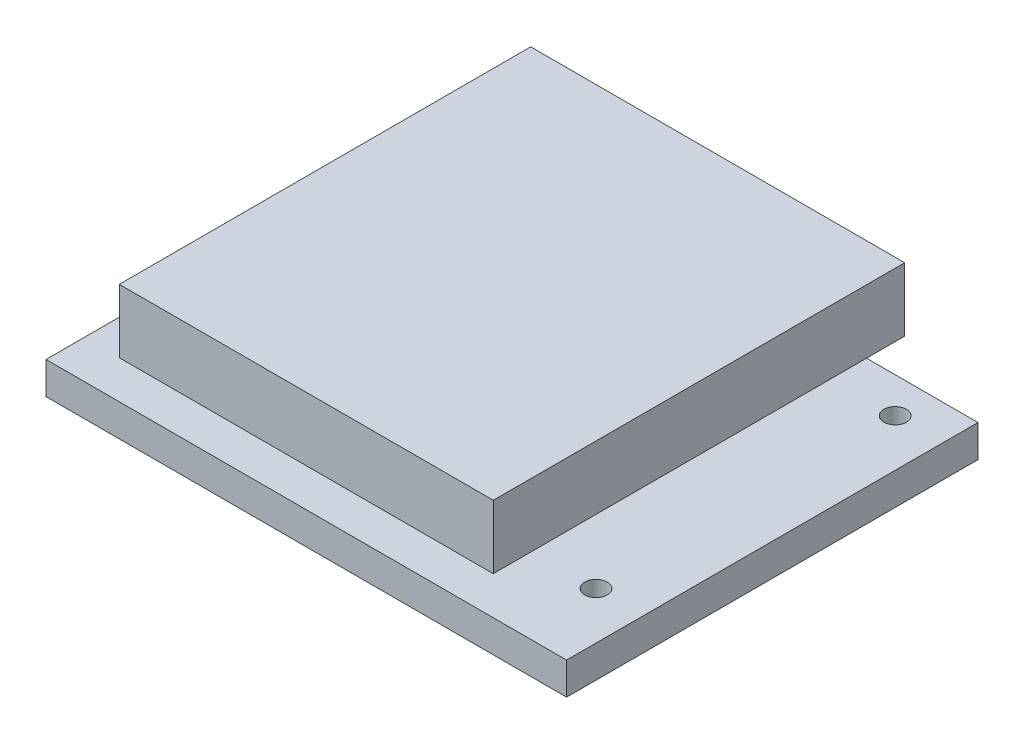
ISO-10303-21;
HEADER;
FILE_DESCRIPTION(('STEP AP214'),'2;1');
FILE_NAME('part.step','',(''),(''),'','','');
FILE_SCHEMA(('AUTOMOTIVE_DESIGN { 1 0 10303 214 1 1 1 1 }'));
ENDSEC;
DATA;
#1=APPLICATION_CONTEXT('core data for automotive mechanical design processes');
#2=APPLICATION_PROTOCOL_DEFINITION('international standard','automotive_design',2000,#1);
#3=PRODUCT_CONTEXT('',#1,'mechanical');
#4=PRODUCT('Part','Part','',(#3));
#5=PRODUCT_RELATED_PRODUCT_CATEGORY('part','',(#4));
#6=PRODUCT_DEFINITION_FORMATION('','',#4);
#7=PRODUCT_DEFINITION_CONTEXT('part definition',#1,'design');
#8=PRODUCT_DEFINITION('design','',#6,#7);
#9=PRODUCT_DEFINITION_SHAPE('','',#8);
#10=(LENGTH_UNIT() NAMED_UNIT(*) SI_UNIT(.MILLI.,.METRE.));
#11=(NAMED_UNIT(*) PLANE_ANGLE_UNIT() SI_UNIT($,.RADIAN.));
#12=(NAMED_UNIT(*) SI_UNIT($,.STERADIAN.) SOLID_ANGLE_UNIT());
#13=UNCERTAINTY_MEASURE_WITH_UNIT(LENGTH_MEASURE(1.E-05),#10,'distance_accuracy_value','');
#14=(GEOMETRIC_REPRESENTATION_CONTEXT(3) GLOBAL_UNCERTAINTY_ASSIGNED_CONTEXT((#13)) GLOBAL_UNIT_ASSIGNED_CONTEXT((#10,
#11,#12)) REPRESENTATION_CONTEXT('',''));
#15=CARTESIAN_POINT('',(0.,0.,0.));
#16=DIRECTION('',(0.,0.,1.));
#17=DIRECTION('',(1.,0.,0.));
#18=AXIS2_PLACEMENT_3D('',#15,#16,#17);
#19=CARTESIAN_POINT('',(-25.,10.9,27.5));
#20=DIRECTION('',(-1.,0.,0.));
#21=DIRECTION('',(0.,0.,1.));
#22=AXIS2_PLACEMENT_3D('',#19,#20,#21);
#23=PLANE('',#22);
#24=DIRECTION('',(0.,0.,-1.));
#25=VECTOR('',#24,1.);
#26=CARTESIAN_POINT('',(-25.,9.4,27.5));
#27=LINE('',#26,#25);
#28=CARTESIAN_POINT('',(-25.,9.4,27.5));
#29=VERTEX_POINT('',#28);
#30=CARTESIAN_POINT('',(-25.,9.4,-27.5));
#31=VERTEX_POINT('',#30);
#32=EDGE_CURVE('E122',#29,#31,#27,.T.);
#33=ORIENTED_EDGE('',*,*,#32,.F.);
#34=DIRECTION('',(0.,-1.,0.));
#35=VECTOR('',#34,1.);
#36=CARTESIAN_POINT('',(-25.,10.9,27.5));
#37=LINE('',#36,#35);
#38=CARTESIAN_POINT('',(-25.,17.9,27.5));
#39=VERTEX_POINT('',#38);
#40=EDGE_CURVE('E12',#39,#29,#37,.T.);
#41=ORIENTED_EDGE('',*,*,#40,.F.);
#42=DIRECTION('',(0.,0.,1.));
#43=VECTOR('',#42,1.);
#44=CARTESIAN_POINT('',(-25.,17.9,27.5));
#45=LINE('',#44,#43);
#46=CARTESIAN_POINT('',(-25.,17.9,-27.5));
#47=VERTEX_POINT('',#46);
#48=EDGE_CURVE('E110',#47,#39,#45,.T.);
#49=ORIENTED_EDGE('',*,*,#48,.F.);
#50=DIRECTION('',(0.,-1.,0.));
#51=VECTOR('',#50,1.);
#52=CARTESIAN_POINT('',(-25.,10.9,-27.5));
#53=LINE('',#52,#51);
#54=EDGE_CURVE('E56',#47,#31,#53,.T.);
#55=ORIENTED_EDGE('',*,*,#54,.T.);
#56=EDGE_LOOP('',(#33,#41,#49,#55));
#57=FACE_BOUND('',#56,.T.);
#58=ADVANCED_FACE('F53',(#57),#23,.T.);
#59=CARTESIAN_POINT('',(-25.,10.9,27.5));
#60=DIRECTION('',(0.,0.,-1.));
#61=DIRECTION('',(-1.,0.,0.));
#62=AXIS2_PLACEMENT_3D('',#59,#60,#61);
#63=PLANE('',#62);
#64=DIRECTION('',(1.,0.,0.));
#65=VECTOR('',#64,1.);
#66=CARTESIAN_POINT('',(-25.,9.4,27.5));
#67=LINE('',#66,#65);
#68=CARTESIAN_POINT('',(25.,9.4,27.5));
#69=VERTEX_POINT('',#68);
#70=EDGE_CURVE('E72',#29,#69,#67,.T.);
#71=ORIENTED_EDGE('',*,*,#70,.T.);
#72=DIRECTION('',(0.,-1.,0.));
#73=VECTOR('',#72,1.);
#74=CARTESIAN_POINT('',(25.,10.9,27.5));
#75=LINE('',#74,#73);
#76=CARTESIAN_POINT('',(25.,17.9,27.5));
#77=VERTEX_POINT('',#76);
#78=EDGE_CURVE('E62',#77,#69,#75,.T.);
#79=ORIENTED_EDGE('',*,*,#78,.F.);
#80=DIRECTION('',(1.,0.,0.));
#81=VECTOR('',#80,1.);
#82=CARTESIAN_POINT('',(-25.,17.9,27.5));
#83=LINE('',#82,#81);
#84=EDGE_CURVE('E114',#39,#77,#83,.T.);
#85=ORIENTED_EDGE('',*,*,#84,.F.);
#86=ORIENTED_EDGE('',*,*,#40,.T.);
#87=EDGE_LOOP('',(#71,#79,#85,#86));
#88=FACE_BOUND('',#87,.T.);
#89=ADVANCED_FACE('F139',(#88),#63,.F.);
#90=CARTESIAN_POINT('',(25.,10.9,27.5));
#91=DIRECTION('',(-1.,0.,0.));
#92=DIRECTION('',(0.,0.,1.));
#93=AXIS2_PLACEMENT_3D('',#90,#91,#92);
#94=PLANE('',#93);
#95=DIRECTION('',(0.,0.,-1.));
#96=VECTOR('',#95,1.);
#97=CARTESIAN_POINT('',(25.,9.4,27.5));
#98=LINE('',#97,#96);
#99=CARTESIAN_POINT('',(25.,9.4,-27.5));
#100=VERTEX_POINT('',#99);
#101=EDGE_CURVE('E98',#69,#100,#98,.T.);
#102=ORIENTED_EDGE('',*,*,#101,.T.);
#103=DIRECTION('',(0.,-1.,0.));
#104=VECTOR('',#103,1.);
#105=CARTESIAN_POINT('',(25.,10.9,-27.5));
#106=LINE('',#105,#104);
#107=CARTESIAN_POINT('',(25.,17.9,-27.5));
#108=VERTEX_POINT('',#107);
#109=EDGE_CURVE('E92',#108,#100,#106,.T.);
#110=ORIENTED_EDGE('',*,*,#109,.F.);
#111=DIRECTION('',(0.,0.,-1.));
#112=VECTOR('',#111,1.);
#113=CARTESIAN_POINT('',(25.,17.9,27.5));
#114=LINE('',#113,#112);
#115=EDGE_CURVE('E96',#77,#108,#114,.T.);
#116=ORIENTED_EDGE('',*,*,#115,.F.);
#117=ORIENTED_EDGE('',*,*,#78,.T.);
#118=EDGE_LOOP('',(#102,#110,#116,#117));
#119=FACE_BOUND('',#118,.T.);
#120=ADVANCED_FACE('F94',(#119),#94,.F.);
#121=CARTESIAN_POINT('',(-25.,10.9,-27.5));
#122=DIRECTION('',(0.,0.,-1.));
#123=DIRECTION('',(-1.,0.,0.));
#124=AXIS2_PLACEMENT_3D('',#121,#122,#123);
#125=PLANE('',#124);
#126=DIRECTION('',(1.,0.,0.));
#127=VECTOR('',#126,1.);
#128=CARTESIAN_POINT('',(-25.,9.4,-27.5));
#129=LINE('',#128,#127);
#130=EDGE_CURVE('E126',#31,#100,#129,.T.);
#131=ORIENTED_EDGE('',*,*,#130,.F.);
#132=ORIENTED_EDGE('',*,*,#54,.F.);
#133=DIRECTION('',(-1.,0.,0.));
#134=VECTOR('',#133,1.);
#135=CARTESIAN_POINT('',(-25.,17.9,-27.5));
#136=LINE('',#135,#134);
#137=EDGE_CURVE('E104',#108,#47,#136,.T.);
#138=ORIENTED_EDGE('',*,*,#137,.F.);
#139=ORIENTED_EDGE('',*,*,#109,.T.);
#140=EDGE_LOOP('',(#131,#132,#138,#139));
#141=FACE_BOUND('',#140,.T.);
#142=ADVANCED_FACE('F105',(#141),#125,.T.);
#143=CARTESIAN_POINT('',(0.,9.4,0.));
#144=DIRECTION('',(0.,-1.,0.));
#145=DIRECTION('',(0.,0.,-1.));
#146=AXIS2_PLACEMENT_3D('',#143,#144,#145);
#147=PLANE('',#146);
#148=ORIENTED_EDGE('',*,*,#32,.T.);
#149=ORIENTED_EDGE('',*,*,#130,.T.);
#150=ORIENTED_EDGE('',*,*,#101,.F.);
#151=ORIENTED_EDGE('',*,*,#70,.F.);
#152=EDGE_LOOP('',(#148,#149,#150,#151));
#153=FACE_BOUND('',#152,.T.);
#154=ADVANCED_FACE('F135',(#153),#147,.T.);
#155=CARTESIAN_POINT('',(0.,17.9,0.));
#156=DIRECTION('',(0.,-1.,0.));
#157=DIRECTION('',(0.,0.,-1.));
#158=AXIS2_PLACEMENT_3D('',#155,#156,#157);
#159=PLANE('',#158);
#160=ORIENTED_EDGE('',*,*,#115,.T.);
#161=ORIENTED_EDGE('',*,*,#137,.T.);
#162=ORIENTED_EDGE('',*,*,#48,.T.);
#163=ORIENTED_EDGE('',*,*,#84,.T.);
#164=EDGE_LOOP('',(#160,#161,#162,#163));
#165=FACE_BOUND('',#164,.T.);
#166=ADVANCED_FACE('F113',(#165),#159,.F.);
#167=CLOSED_SHELL('',(#58,#89,#120,#142,#154,#166));
#168=MANIFOLD_SOLID_BREP('B2',#167);
#169=CARTESIAN_POINT('',(0.,4.3,0.));
#170=DIRECTION('',(0.,-1.,0.));
#171=DIRECTION('',(0.,0.,-1.));
#172=AXIS2_PLACEMENT_3D('',#169,#170,#171);
#173=PLANE('',#172);
#174=DIRECTION('',(0.,0.,-1.));
#175=VECTOR('',#174,1.);
#176=CARTESIAN_POINT('',(34.8,4.3,27.5));
#177=LINE('',#176,#175);
#178=CARTESIAN_POINT('',(34.8,4.3,27.5));
#179=VERTEX_POINT('',#178);
#180=CARTESIAN_POINT('',(34.8,4.3,-27.5));
#181=VERTEX_POINT('',#180);
#182=EDGE_CURVE('E265',#179,#181,#177,.T.);
#183=ORIENTED_EDGE('',*,*,#182,.T.);
#184=DIRECTION('',(-1.,0.,0.));
#185=VECTOR('',#184,1.);
#186=CARTESIAN_POINT('',(-34.8,4.3,-27.5));
#187=LINE('',#186,#185);
#188=CARTESIAN_POINT('',(-34.8,4.3,-27.5));
#189=VERTEX_POINT('',#188);
#190=EDGE_CURVE('E260',#181,#189,#187,.T.);
#191=ORIENTED_EDGE('',*,*,#190,.T.);
#192=DIRECTION('',(0.,0.,1.));
#193=VECTOR('',#192,1.);
#194=CARTESIAN_POINT('',(-34.8,4.3,27.5));
#195=LINE('',#194,#193);
#196=CARTESIAN_POINT('',(-34.8,4.3,27.5));
#197=VERTEX_POINT('',#196);
#198=EDGE_CURVE('E263',#189,#197,#195,.T.);
#199=ORIENTED_EDGE('',*,*,#198,.T.);
#200=DIRECTION('',(1.,0.,0.));
#201=VECTOR('',#200,1.);
#202=CARTESIAN_POINT('',(-34.8,4.3,27.5));
#203=LINE('',#202,#201);
#204=EDGE_CURVE('E230',#197,#179,#203,.T.);
#205=ORIENTED_EDGE('',*,*,#204,.T.);
#206=EDGE_LOOP('',(#183,#191,#199,#205));
#207=FACE_BOUND('',#206,.T.);
#208=CARTESIAN_POINT('',(28.479128440367,4.3,-22.75));
#209=DIRECTION('',(0.,1.,0.));
#210=DIRECTION('',(0.,0.,1.));
#211=AXIS2_PLACEMENT_3D('',#208,#209,#210);
#212=CIRCLE('',#211,1.5);
#213=CARTESIAN_POINT('',(28.479128440367,4.3,-24.25));
#214=VERTEX_POINT('',#213);
#215=EDGE_CURVE('E280',#214,#214,#212,.T.);
#216=ORIENTED_EDGE('',*,*,#215,.F.);
#217=EDGE_LOOP('',(#216));
#218=FACE_BOUND('',#217,.T.);
#219=CARTESIAN_POINT('',(28.479128440367,4.3,17.25));
#220=DIRECTION('',(0.,1.,0.));
#221=DIRECTION('',(0.,0.,1.));
#222=AXIS2_PLACEMENT_3D('',#219,#220,#221);
#223=CIRCLE('',#222,1.5);
#224=CARTESIAN_POINT('',(28.479128440367,4.3,15.75));
#225=VERTEX_POINT('',#224);
#226=EDGE_CURVE('E295',#225,#225,#223,.T.);
#227=ORIENTED_EDGE('',*,*,#226,.F.);
#228=EDGE_LOOP('',(#227));
#229=FACE_BOUND('',#228,.T.);
#230=CARTESIAN_POINT('',(-28.479128440367,4.3,17.25));
#231=DIRECTION('',(0.,1.,0.));
#232=DIRECTION('',(0.,0.,-1.));
#233=AXIS2_PLACEMENT_3D('',#230,#231,#232);
#234=CIRCLE('',#233,1.5);
#235=CARTESIAN_POINT('',(-28.479128440367,4.3,15.75));
#236=VERTEX_POINT('',#235);
#237=EDGE_CURVE('E301',#236,#236,#234,.T.);
#238=ORIENTED_EDGE('',*,*,#237,.F.);
#239=EDGE_LOOP('',(#238));
#240=FACE_BOUND('',#239,.T.);
#241=CARTESIAN_POINT('',(-28.479128440367,4.3,-22.75));
#242=DIRECTION('',(0.,1.,0.));
#243=DIRECTION('',(0.,0.,-1.));
#244=AXIS2_PLACEMENT_3D('',#241,#242,#243);
#245=CIRCLE('',#244,1.5);
#246=CARTESIAN_POINT('',(-28.479128440367,4.3,-24.25));
#247=VERTEX_POINT('',#246);
#248=EDGE_CURVE('E307',#247,#247,#245,.T.);
#249=ORIENTED_EDGE('',*,*,#248,.F.);
#250=EDGE_LOOP('',(#249));
#251=FACE_BOUND('',#250,.T.);
#252=ADVANCED_FACE('F213',(#207,#218,#229,#240,#251),#173,.F.);
#253=CARTESIAN_POINT('',(0.,0.,0.));
#254=DIRECTION('',(0.,-1.,0.));
#255=DIRECTION('',(0.,0.,-1.));
#256=AXIS2_PLACEMENT_3D('',#253,#254,#255);
#257=PLANE('',#256);
#258=CARTESIAN_POINT('',(-28.479128440367,0.,17.25));
#259=DIRECTION('',(0.,1.,0.));
#260=DIRECTION('',(0.,0.,-1.));
#261=AXIS2_PLACEMENT_3D('',#258,#259,#260);
#262=CIRCLE('',#261,1.5);
#263=CARTESIAN_POINT('',(-28.479128440367,0.,15.75));
#264=VERTEX_POINT('',#263);
#265=EDGE_CURVE('E304',#264,#264,#262,.T.);
#266=ORIENTED_EDGE('',*,*,#265,.T.);
#267=EDGE_LOOP('',(#266));
#268=FACE_BOUND('',#267,.T.);
#269=CARTESIAN_POINT('',(28.479128440367,0.,-22.75));
#270=DIRECTION('',(0.,1.,0.));
#271=DIRECTION('',(0.,0.,1.));
#272=AXIS2_PLACEMENT_3D('',#269,#270,#271);
#273=CIRCLE('',#272,1.5);
#274=CARTESIAN_POINT('',(28.479128440367,0.,-24.25));
#275=VERTEX_POINT('',#274);
#276=EDGE_CURVE('E292',#275,#275,#273,.T.);
#277=ORIENTED_EDGE('',*,*,#276,.T.);
#278=EDGE_LOOP('',(#277));
#279=FACE_BOUND('',#278,.T.);
#280=DIRECTION('',(0.,0.,-1.));
#281=VECTOR('',#280,1.);
#282=CARTESIAN_POINT('',(34.8,0.,27.5));
#283=LINE('',#282,#281);
#284=CARTESIAN_POINT('',(34.8,0.,27.5));
#285=VERTEX_POINT('',#284);
#286=CARTESIAN_POINT('',(34.8,0.,-27.5));
#287=VERTEX_POINT('',#286);
#288=EDGE_CURVE('E277',#285,#287,#283,.T.);
#289=ORIENTED_EDGE('',*,*,#288,.F.);
#290=DIRECTION('',(1.,0.,0.));
#291=VECTOR('',#290,1.);
#292=CARTESIAN_POINT('',(-34.8,0.,27.5));
#293=LINE('',#292,#291);
#294=CARTESIAN_POINT('',(-34.8,0.,27.5));
#295=VERTEX_POINT('',#294);
#296=EDGE_CURVE('E253',#295,#285,#293,.T.);
#297=ORIENTED_EDGE('',*,*,#296,.F.);
#298=DIRECTION('',(0.,0.,1.));
#299=VECTOR('',#298,1.);
#300=CARTESIAN_POINT('',(-34.8,0.,27.5));
#301=LINE('',#300,#299);
#302=CARTESIAN_POINT('',(-34.8,0.,-27.5));
#303=VERTEX_POINT('',#302);
#304=EDGE_CURVE('E247',#303,#295,#301,.T.);
#305=ORIENTED_EDGE('',*,*,#304,.F.);
#306=DIRECTION('',(-1.,0.,0.));
#307=VECTOR('',#306,1.);
#308=CARTESIAN_POINT('',(-34.8,0.,-27.5));
#309=LINE('',#308,#307);
#310=EDGE_CURVE('E269',#287,#303,#309,.T.);
#311=ORIENTED_EDGE('',*,*,#310,.F.);
#312=EDGE_LOOP('',(#289,#297,#305,#311));
#313=FACE_BOUND('',#312,.T.);
#314=CARTESIAN_POINT('',(28.479128440367,0.,17.25));
#315=DIRECTION('',(0.,1.,0.));
#316=DIRECTION('',(0.,0.,1.));
#317=AXIS2_PLACEMENT_3D('',#314,#315,#316);
#318=CIRCLE('',#317,1.5);
#319=CARTESIAN_POINT('',(28.479128440367,0.,15.75));
#320=VERTEX_POINT('',#319);
#321=EDGE_CURVE('E298',#320,#320,#318,.T.);
#322=ORIENTED_EDGE('',*,*,#321,.T.);
#323=EDGE_LOOP('',(#322));
#324=FACE_BOUND('',#323,.T.);
#325=CARTESIAN_POINT('',(-28.479128440367,0.,-22.75));
#326=DIRECTION('',(0.,1.,0.));
#327=DIRECTION('',(0.,0.,-1.));
#328=AXIS2_PLACEMENT_3D('',#325,#326,#327);
#329=CIRCLE('',#328,1.5);
#330=CARTESIAN_POINT('',(-28.479128440367,0.,-24.25));
#331=VERTEX_POINT('',#330);
#332=EDGE_CURVE('E310',#331,#331,#329,.T.);
#333=ORIENTED_EDGE('',*,*,#332,.T.);
#334=EDGE_LOOP('',(#333));
#335=FACE_BOUND('',#334,.T.);
#336=ADVANCED_FACE('F288',(#268,#279,#313,#324,#335),#257,.T.);
#337=CARTESIAN_POINT('',(34.8,4.3,27.5));
#338=DIRECTION('',(-1.,0.,0.));
#339=DIRECTION('',(0.,0.,1.));
#340=AXIS2_PLACEMENT_3D('',#337,#338,#339);
#341=PLANE('',#340);
#342=ORIENTED_EDGE('',*,*,#288,.T.);
#343=DIRECTION('',(0.,-1.,0.));
#344=VECTOR('',#343,1.);
#345=CARTESIAN_POINT('',(34.8,4.3,-27.5));
#346=LINE('',#345,#344);
#347=EDGE_CURVE('E51',#181,#287,#346,.T.);
#348=ORIENTED_EDGE('',*,*,#347,.F.);
#349=ORIENTED_EDGE('',*,*,#182,.F.);
#350=DIRECTION('',(0.,-1.,0.));
#351=VECTOR('',#350,1.);
#352=CARTESIAN_POINT('',(34.8,4.3,27.5));
#353=LINE('',#352,#351);
#354=EDGE_CURVE('E273',#179,#285,#353,.T.);
#355=ORIENTED_EDGE('',*,*,#354,.T.);
#356=EDGE_LOOP('',(#342,#348,#349,#355));
#357=FACE_BOUND('',#356,.T.);
#358=ADVANCED_FACE('F215',(#357),#341,.F.);
#359=CARTESIAN_POINT('',(-34.8,4.3,-27.5));
#360=DIRECTION('',(0.,0.,1.));
#361=DIRECTION('',(1.,0.,0.));
#362=AXIS2_PLACEMENT_3D('',#359,#360,#361);
#363=PLANE('',#362);
#364=ORIENTED_EDGE('',*,*,#310,.T.);
#365=DIRECTION('',(0.,-1.,0.));
#366=VECTOR('',#365,1.);
#367=CARTESIAN_POINT('',(-34.8,4.3,-27.5));
#368=LINE('',#367,#366);
#369=EDGE_CURVE('E222',#189,#303,#368,.T.);
#370=ORIENTED_EDGE('',*,*,#369,.F.);
#371=ORIENTED_EDGE('',*,*,#190,.F.);
#372=ORIENTED_EDGE('',*,*,#347,.T.);
#373=EDGE_LOOP('',(#364,#370,#371,#372));
#374=FACE_BOUND('',#373,.T.);
#375=ADVANCED_FACE('F268',(#374),#363,.F.);
#376=CARTESIAN_POINT('',(-34.8,4.3,27.5));
#377=DIRECTION('',(1.,0.,0.));
#378=DIRECTION('',(0.,0.,-1.));
#379=AXIS2_PLACEMENT_3D('',#376,#377,#378);
#380=PLANE('',#379);
#381=ORIENTED_EDGE('',*,*,#304,.T.);
#382=DIRECTION('',(0.,-1.,0.));
#383=VECTOR('',#382,1.);
#384=CARTESIAN_POINT('',(-34.8,4.3,27.5));
#385=LINE('',#384,#383);
#386=EDGE_CURVE('E270',#197,#295,#385,.T.);
#387=ORIENTED_EDGE('',*,*,#386,.F.);
#388=ORIENTED_EDGE('',*,*,#198,.F.);
#389=ORIENTED_EDGE('',*,*,#369,.T.);
#390=EDGE_LOOP('',(#381,#387,#388,#389));
#391=FACE_BOUND('',#390,.T.);
#392=ADVANCED_FACE('F271',(#391),#380,.F.);
#393=CARTESIAN_POINT('',(-34.8,4.3,27.5));
#394=DIRECTION('',(0.,0.,-1.));
#395=DIRECTION('',(-1.,0.,0.));
#396=AXIS2_PLACEMENT_3D('',#393,#394,#395);
#397=PLANE('',#396);
#398=ORIENTED_EDGE('',*,*,#296,.T.);
#399=ORIENTED_EDGE('',*,*,#354,.F.);
#400=ORIENTED_EDGE('',*,*,#204,.F.);
#401=ORIENTED_EDGE('',*,*,#386,.T.);
#402=EDGE_LOOP('',(#398,#399,#400,#401));
#403=FACE_BOUND('',#402,.T.);
#404=ADVANCED_FACE('F285',(#403),#397,.F.);
#405=CARTESIAN_POINT('',(28.479128440367,4.3,-22.75));
#406=DIRECTION('',(0.,-1.,0.));
#407=DIRECTION('',(0.,0.,-1.));
#408=AXIS2_PLACEMENT_3D('',#405,#406,#407);
#409=CYLINDRICAL_SURFACE('',#408,1.5);
#410=CARTESIAN_POINT('',(28.479128440367,4.3,-24.25));
#411=CARTESIAN_POINT('',(28.479128440367,4.25520833333333,-24.25));
#412=CARTESIAN_POINT('',(28.479128440367,4.21041666666667,-24.25));
#413=CARTESIAN_POINT('',(28.479128440367,4.12083333333333,-24.25));
#414=CARTESIAN_POINT('',(28.479128440367,4.07604166666667,-24.25));
#415=CARTESIAN_POINT('',(28.479128440367,3.98645833333333,-24.25));
#416=CARTESIAN_POINT('',(28.479128440367,3.94166666666667,-24.25));
#417=CARTESIAN_POINT('',(28.479128440367,3.85208333333333,-24.25));
#418=CARTESIAN_POINT('',(28.479128440367,3.80729166666667,-24.25));
#419=CARTESIAN_POINT('',(28.479128440367,3.71770833333333,-24.25));
#420=CARTESIAN_POINT('',(28.479128440367,3.67291666666667,-24.25));
#421=CARTESIAN_POINT('',(28.479128440367,3.58333333333333,-24.25));
#422=CARTESIAN_POINT('',(28.479128440367,3.53854166666667,-24.25));
#423=CARTESIAN_POINT('',(28.479128440367,3.44895833333333,-24.25));
#424=CARTESIAN_POINT('',(28.479128440367,3.40416666666667,-24.25));
#425=CARTESIAN_POINT('',(28.479128440367,3.31458333333333,-24.25));
#426=CARTESIAN_POINT('',(28.479128440367,3.26979166666667,-24.25));
#427=CARTESIAN_POINT('',(28.479128440367,3.18020833333333,-24.25));
#428=CARTESIAN_POINT('',(28.479128440367,3.13541666666667,-24.25));
#429=CARTESIAN_POINT('',(28.479128440367,3.04583333333333,-24.25));
#430=CARTESIAN_POINT('',(28.479128440367,3.00104166666667,-24.25));
#431=CARTESIAN_POINT('',(28.479128440367,2.91145833333333,-24.25));
#432=CARTESIAN_POINT('',(28.479128440367,2.86666666666667,-24.25));
#433=CARTESIAN_POINT('',(28.479128440367,2.77708333333333,-24.25));
#434=CARTESIAN_POINT('',(28.479128440367,2.73229166666667,-24.25));
#435=CARTESIAN_POINT('',(28.479128440367,2.64270833333333,-24.25));
#436=CARTESIAN_POINT('',(28.479128440367,2.59791666666667,-24.25));
#437=CARTESIAN_POINT('',(28.479128440367,2.50833333333333,-24.25));
#438=CARTESIAN_POINT('',(28.479128440367,2.46354166666667,-24.25));
#439=CARTESIAN_POINT('',(28.479128440367,2.37395833333333,-24.25));
#440=CARTESIAN_POINT('',(28.479128440367,2.32916666666667,-24.25));
#441=CARTESIAN_POINT('',(28.479128440367,2.23958333333333,-24.25));
#442=CARTESIAN_POINT('',(28.479128440367,2.19479166666667,-24.25));
#443=CARTESIAN_POINT('',(28.479128440367,2.10520833333333,-24.25));
#444=CARTESIAN_POINT('',(28.479128440367,2.06041666666667,-24.25));
#445=CARTESIAN_POINT('',(28.479128440367,1.97083333333333,-24.25));
#446=CARTESIAN_POINT('',(28.479128440367,1.92604166666667,-24.25));
#447=CARTESIAN_POINT('',(28.479128440367,1.83645833333333,-24.25));
#448=CARTESIAN_POINT('',(28.479128440367,1.79166666666667,-24.25));
#449=CARTESIAN_POINT('',(28.479128440367,1.70208333333333,-24.25));
#450=CARTESIAN_POINT('',(28.479128440367,1.65729166666667,-24.25));
#451=CARTESIAN_POINT('',(28.479128440367,1.56770833333333,-24.25));
#452=CARTESIAN_POINT('',(28.479128440367,1.52291666666667,-24.25));
#453=CARTESIAN_POINT('',(28.479128440367,1.43333333333333,-24.25));
#454=CARTESIAN_POINT('',(28.479128440367,1.38854166666667,-24.25));
#455=CARTESIAN_POINT('',(28.479128440367,1.29895833333333,-24.25));
#456=CARTESIAN_POINT('',(28.479128440367,1.25416666666667,-24.25));
#457=CARTESIAN_POINT('',(28.479128440367,1.16458333333333,-24.25));
#458=CARTESIAN_POINT('',(28.479128440367,1.11979166666667,-24.25));
#459=CARTESIAN_POINT('',(28.479128440367,1.03020833333333,-24.25));
#460=CARTESIAN_POINT('',(28.479128440367,0.985416666666666,-24.25));
#461=CARTESIAN_POINT('',(28.479128440367,0.895833333333333,-24.25));
#462=CARTESIAN_POINT('',(28.479128440367,0.851041666666666,-24.25));
#463=CARTESIAN_POINT('',(28.479128440367,0.761458333333333,-24.25));
#464=CARTESIAN_POINT('',(28.479128440367,0.716666666666666,-24.25));
#465=CARTESIAN_POINT('',(28.479128440367,0.627083333333333,-24.25));
#466=CARTESIAN_POINT('',(28.479128440367,0.582291666666666,-24.25));
#467=CARTESIAN_POINT('',(28.479128440367,0.492708333333333,-24.25));
#468=CARTESIAN_POINT('',(28.479128440367,0.447916666666666,-24.25));
#469=CARTESIAN_POINT('',(28.479128440367,0.358333333333333,-24.25));
#470=CARTESIAN_POINT('',(28.479128440367,0.313541666666666,-24.25));
#471=CARTESIAN_POINT('',(28.479128440367,0.223958333333332,-24.25));
#472=CARTESIAN_POINT('',(28.479128440367,0.179166666666666,-24.25));
#473=CARTESIAN_POINT('',(28.479128440367,0.0895833333333324,-24.25));
#474=CARTESIAN_POINT('',(28.479128440367,0.0447916666666658,-24.25));
#475=CARTESIAN_POINT('',(28.479128440367,0.,-24.25));
#476=B_SPLINE_CURVE_WITH_KNOTS('',3,(#410,#411,#412,#413,#414,#415,#416,#417,#418,#419,#420,
#421,#422,#423,#424,#425,#426,#427,#428,#429,#430,#431,#432,#433,#434,#435,#436,#437,#438,#439,
#440,#441,#442,#443,#444,#445,#446,#447,#448,#449,#450,#451,#452,#453,#454,#455,#456,#457,#458,
#459,#460,#461,#462,#463,#464,#465,#466,#467,#468,#469,#470,#471,#472,#473,#474,#475),
.UNSPECIFIED.,.F.,.F.,(4,2,2,2,2,2,2,2,2,2,2,2,2,2,2,2,2,2,2,2,2,2,2,2,2,2,2,2,2,2,2,2,4),(0.,
0.134375,0.26875,0.403124999999999,0.5375,0.671875,0.80625,0.940625,1.075,1.209375,1.34375,
1.478125,1.6125,1.746875,1.88125,2.015625,2.15,2.284375,2.41875,2.553125,2.6875,2.821875,
2.95625,3.090625,3.225,3.359375,3.49375,3.628125,3.7625,3.896875,4.03125,4.165625,4.3),.UNSPECIFIED.);
#477=EDGE_CURVE('BSEAM327',#214,#275,#476,.T.);
#478=ORIENTED_EDGE('',*,*,#215,.T.);
#479=ORIENTED_EDGE('',*,*,#276,.F.);
#480=ORIENTED_EDGE('',*,*,#477,.T.);
#481=ORIENTED_EDGE('',*,*,#477,.F.);
#482=EDGE_LOOP('',(#478,#480,#479,#481));
#483=FACE_BOUND('',#482,.T.);
#484=ADVANCED_FACE('F327',(#483),#409,.F.);
#485=CARTESIAN_POINT('',(28.479128440367,4.3,17.25));
#486=DIRECTION('',(0.,-1.,0.));
#487=DIRECTION('',(0.,0.,-1.));
#488=AXIS2_PLACEMENT_3D('',#485,#486,#487);
#489=CYLINDRICAL_SURFACE('',#488,1.5);
#490=CARTESIAN_POINT('',(28.479128440367,4.3,15.75));
#491=CARTESIAN_POINT('',(28.479128440367,4.25520833333333,15.75));
#492=CARTESIAN_POINT('',(28.479128440367,4.21041666666667,15.75));
#493=CARTESIAN_POINT('',(28.479128440367,4.12083333333333,15.75));
#494=CARTESIAN_POINT('',(28.479128440367,4.07604166666667,15.75));
#495=CARTESIAN_POINT('',(28.479128440367,3.98645833333333,15.75));
#496=CARTESIAN_POINT('',(28.479128440367,3.94166666666667,15.75));
#497=CARTESIAN_POINT('',(28.479128440367,3.85208333333333,15.75));
#498=CARTESIAN_POINT('',(28.479128440367,3.80729166666667,15.75));
#499=CARTESIAN_POINT('',(28.479128440367,3.71770833333333,15.75));
#500=CARTESIAN_POINT('',(28.479128440367,3.67291666666667,15.75));
#501=CARTESIAN_POINT('',(28.479128440367,3.58333333333333,15.75));
#502=CARTESIAN_POINT('',(28.479128440367,3.53854166666667,15.75));
#503=CARTESIAN_POINT('',(28.479128440367,3.44895833333333,15.75));
#504=CARTESIAN_POINT('',(28.479128440367,3.40416666666667,15.75));
#505=CARTESIAN_POINT('',(28.479128440367,3.31458333333333,15.75));
#506=CARTESIAN_POINT('',(28.479128440367,3.26979166666667,15.75));
#507=CARTESIAN_POINT('',(28.479128440367,3.18020833333333,15.75));
#508=CARTESIAN_POINT('',(28.479128440367,3.13541666666667,15.75));
#509=CARTESIAN_POINT('',(28.479128440367,3.04583333333333,15.75));
#510=CARTESIAN_POINT('',(28.479128440367,3.00104166666667,15.75));
#511=CARTESIAN_POINT('',(28.479128440367,2.91145833333333,15.75));
#512=CARTESIAN_POINT('',(28.479128440367,2.86666666666667,15.75));
#513=CARTESIAN_POINT('',(28.479128440367,2.77708333333333,15.75));
#514=CARTESIAN_POINT('',(28.479128440367,2.73229166666667,15.75));
#515=CARTESIAN_POINT('',(28.479128440367,2.64270833333333,15.75));
#516=CARTESIAN_POINT('',(28.479128440367,2.59791666666667,15.75));
#517=CARTESIAN_POINT('',(28.479128440367,2.50833333333333,15.75));
#518=CARTESIAN_POINT('',(28.479128440367,2.46354166666667,15.75));
#519=CARTESIAN_POINT('',(28.479128440367,2.37395833333333,15.75));
#520=CARTESIAN_POINT('',(28.479128440367,2.32916666666667,15.75));
#521=CARTESIAN_POINT('',(28.479128440367,2.23958333333333,15.75));
#522=CARTESIAN_POINT('',(28.479128440367,2.19479166666667,15.75));
#523=CARTESIAN_POINT('',(28.479128440367,2.10520833333333,15.75));
#524=CARTESIAN_POINT('',(28.479128440367,2.06041666666667,15.75));
#525=CARTESIAN_POINT('',(28.479128440367,1.97083333333333,15.75));
#526=CARTESIAN_POINT('',(28.479128440367,1.92604166666667,15.75));
#527=CARTESIAN_POINT('',(28.479128440367,1.83645833333333,15.75));
#528=CARTESIAN_POINT('',(28.479128440367,1.79166666666667,15.75));
#529=CARTESIAN_POINT('',(28.479128440367,1.70208333333333,15.75));
#530=CARTESIAN_POINT('',(28.479128440367,1.65729166666667,15.75));
#531=CARTESIAN_POINT('',(28.479128440367,1.56770833333333,15.75));
#532=CARTESIAN_POINT('',(28.479128440367,1.52291666666667,15.75));
#533=CARTESIAN_POINT('',(28.479128440367,1.43333333333333,15.75));
#534=CARTESIAN_POINT('',(28.479128440367,1.38854166666667,15.75));
#535=CARTESIAN_POINT('',(28.479128440367,1.29895833333333,15.75));
#536=CARTESIAN_POINT('',(28.479128440367,1.25416666666667,15.75));
#537=CARTESIAN_POINT('',(28.479128440367,1.16458333333333,15.75));
#538=CARTESIAN_POINT('',(28.479128440367,1.11979166666667,15.75));
#539=CARTESIAN_POINT('',(28.479128440367,1.03020833333333,15.75));
#540=CARTESIAN_POINT('',(28.479128440367,0.985416666666666,15.75));
#541=CARTESIAN_POINT('',(28.479128440367,0.895833333333333,15.75));
#542=CARTESIAN_POINT('',(28.479128440367,0.851041666666666,15.75));
#543=CARTESIAN_POINT('',(28.479128440367,0.761458333333333,15.75));
#544=CARTESIAN_POINT('',(28.479128440367,0.716666666666666,15.75));
#545=CARTESIAN_POINT('',(28.479128440367,0.627083333333333,15.75));
#546=CARTESIAN_POINT('',(28.479128440367,0.582291666666666,15.75));
#547=CARTESIAN_POINT('',(28.479128440367,0.492708333333333,15.75));
#548=CARTESIAN_POINT('',(28.479128440367,0.447916666666666,15.75));
#549=CARTESIAN_POINT('',(28.479128440367,0.358333333333333,15.75));
#550=CARTESIAN_POINT('',(28.479128440367,0.313541666666666,15.75));
#551=CARTESIAN_POINT('',(28.479128440367,0.223958333333332,15.75));
#552=CARTESIAN_POINT('',(28.479128440367,0.179166666666666,15.75));
#553=CARTESIAN_POINT('',(28.479128440367,0.0895833333333324,15.75));
#554=CARTESIAN_POINT('',(28.479128440367,0.0447916666666658,15.75));
#555=CARTESIAN_POINT('',(28.479128440367,0.,15.75));
#556=B_SPLINE_CURVE_WITH_KNOTS('',3,(#490,#491,#492,#493,#494,#495,#496,#497,#498,#499,#500,
#501,#502,#503,#504,#505,#506,#507,#508,#509,#510,#511,#512,#513,#514,#515,#516,#517,#518,#519,
#520,#521,#522,#523,#524,#525,#526,#527,#528,#529,#530,#531,#532,#533,#534,#535,#536,#537,#538,
#539,#540,#541,#542,#543,#544,#545,#546,#547,#548,#549,#550,#551,#552,#553,#554,#555),
.UNSPECIFIED.,.F.,.F.,(4,2,2,2,2,2,2,2,2,2,2,2,2,2,2,2,2,2,2,2,2,2,2,2,2,2,2,2,2,2,2,2,4),(0.,
0.134375,0.26875,0.403124999999999,0.5375,0.671875,0.80625,0.940625,1.075,1.209375,1.34375,
1.478125,1.6125,1.746875,1.88125,2.015625,2.15,2.284375,2.41875,2.553125,2.6875,2.821875,
2.95625,3.090625,3.225,3.359375,3.49375,3.628125,3.7625,3.896875,4.03125,4.165625,4.3),.UNSPECIFIED.);
#557=EDGE_CURVE('BSEAM381',#225,#320,#556,.T.);
#558=ORIENTED_EDGE('',*,*,#226,.T.);
#559=ORIENTED_EDGE('',*,*,#321,.F.);
#560=ORIENTED_EDGE('',*,*,#557,.T.);
#561=ORIENTED_EDGE('',*,*,#557,.F.);
#562=EDGE_LOOP('',(#558,#560,#559,#561));
#563=FACE_BOUND('',#562,.T.);
#564=ADVANCED_FACE('F381',(#563),#489,.F.);
#565=CARTESIAN_POINT('',(-28.479128440367,4.3,17.25));
#566=DIRECTION('',(0.,-1.,0.));
#567=DIRECTION('',(0.,0.,-1.));
#568=AXIS2_PLACEMENT_3D('',#565,#566,#567);
#569=CYLINDRICAL_SURFACE('',#568,1.5);
#570=CARTESIAN_POINT('',(-28.479128440367,4.3,15.75));
#571=CARTESIAN_POINT('',(-28.479128440367,4.25520833333333,15.75));
#572=CARTESIAN_POINT('',(-28.479128440367,4.21041666666667,15.75));
#573=CARTESIAN_POINT('',(-28.479128440367,4.12083333333333,15.75));
#574=CARTESIAN_POINT('',(-28.479128440367,4.07604166666667,15.75));
#575=CARTESIAN_POINT('',(-28.479128440367,3.98645833333333,15.75));
#576=CARTESIAN_POINT('',(-28.479128440367,3.94166666666667,15.75));
#577=CARTESIAN_POINT('',(-28.479128440367,3.85208333333333,15.75));
#578=CARTESIAN_POINT('',(-28.479128440367,3.80729166666667,15.75));
#579=CARTESIAN_POINT('',(-28.479128440367,3.71770833333333,15.75));
#580=CARTESIAN_POINT('',(-28.479128440367,3.67291666666667,15.75));
#581=CARTESIAN_POINT('',(-28.479128440367,3.58333333333333,15.75));
#582=CARTESIAN_POINT('',(-28.479128440367,3.53854166666667,15.75));
#583=CARTESIAN_POINT('',(-28.479128440367,3.44895833333333,15.75));
#584=CARTESIAN_POINT('',(-28.479128440367,3.40416666666667,15.75));
#585=CARTESIAN_POINT('',(-28.479128440367,3.31458333333333,15.75));
#586=CARTESIAN_POINT('',(-28.479128440367,3.26979166666667,15.75));
#587=CARTESIAN_POINT('',(-28.479128440367,3.18020833333333,15.75));
#588=CARTESIAN_POINT('',(-28.479128440367,3.13541666666667,15.75));
#589=CARTESIAN_POINT('',(-28.479128440367,3.04583333333333,15.75));
#590=CARTESIAN_POINT('',(-28.479128440367,3.00104166666667,15.75));
#591=CARTESIAN_POINT('',(-28.479128440367,2.91145833333333,15.75));
#592=CARTESIAN_POINT('',(-28.479128440367,2.86666666666667,15.75));
#593=CARTESIAN_POINT('',(-28.479128440367,2.77708333333333,15.75));
#594=CARTESIAN_POINT('',(-28.479128440367,2.73229166666667,15.75));
#595=CARTESIAN_POINT('',(-28.479128440367,2.64270833333333,15.75));
#596=CARTESIAN_POINT('',(-28.479128440367,2.59791666666667,15.75));
#597=CARTESIAN_POINT('',(-28.479128440367,2.50833333333333,15.75));
#598=CARTESIAN_POINT('',(-28.479128440367,2.46354166666667,15.75));
#599=CARTESIAN_POINT('',(-28.479128440367,2.37395833333333,15.75));
#600=CARTESIAN_POINT('',(-28.479128440367,2.32916666666667,15.75));
#601=CARTESIAN_POINT('',(-28.479128440367,2.23958333333333,15.75));
#602=CARTESIAN_POINT('',(-28.479128440367,2.19479166666667,15.75));
#603=CARTESIAN_POINT('',(-28.479128440367,2.10520833333333,15.75));
#604=CARTESIAN_POINT('',(-28.479128440367,2.06041666666667,15.75));
#605=CARTESIAN_POINT('',(-28.479128440367,1.97083333333333,15.75));
#606=CARTESIAN_POINT('',(-28.479128440367,1.92604166666667,15.75));
#607=CARTESIAN_POINT('',(-28.479128440367,1.83645833333333,15.75));
#608=CARTESIAN_POINT('',(-28.479128440367,1.79166666666667,15.75));
#609=CARTESIAN_POINT('',(-28.479128440367,1.70208333333333,15.75));
#610=CARTESIAN_POINT('',(-28.479128440367,1.65729166666667,15.75));
#611=CARTESIAN_POINT('',(-28.479128440367,1.56770833333333,15.75));
#612=CARTESIAN_POINT('',(-28.479128440367,1.52291666666667,15.75));
#613=CARTESIAN_POINT('',(-28.479128440367,1.43333333333333,15.75));
#614=CARTESIAN_POINT('',(-28.479128440367,1.38854166666667,15.75));
#615=CARTESIAN_POINT('',(-28.479128440367,1.29895833333333,15.75));
#616=CARTESIAN_POINT('',(-28.479128440367,1.25416666666667,15.75));
#617=CARTESIAN_POINT('',(-28.479128440367,1.16458333333333,15.75));
#618=CARTESIAN_POINT('',(-28.479128440367,1.11979166666667,15.75));
#619=CARTESIAN_POINT('',(-28.479128440367,1.03020833333333,15.75));
#620=CARTESIAN_POINT('',(-28.479128440367,0.985416666666666,15.75));
#621=CARTESIAN_POINT('',(-28.479128440367,0.895833333333333,15.75));
#622=CARTESIAN_POINT('',(-28.479128440367,0.851041666666666,15.75));
#623=CARTESIAN_POINT('',(-28.479128440367,0.761458333333333,15.75));
#624=CARTESIAN_POINT('',(-28.479128440367,0.716666666666666,15.75));
#625=CARTESIAN_POINT('',(-28.479128440367,0.627083333333333,15.75));
#626=CARTESIAN_POINT('',(-28.479128440367,0.582291666666666,15.75));
#627=CARTESIAN_POINT('',(-28.479128440367,0.492708333333333,15.75));
#628=CARTESIAN_POINT('',(-28.479128440367,0.447916666666666,15.75));
#629=CARTESIAN_POINT('',(-28.479128440367,0.358333333333333,15.75));
#630=CARTESIAN_POINT('',(-28.479128440367,0.313541666666666,15.75));
#631=CARTESIAN_POINT('',(-28.479128440367,0.223958333333332,15.75));
#632=CARTESIAN_POINT('',(-28.479128440367,0.179166666666666,15.75));
#633=CARTESIAN_POINT('',(-28.479128440367,0.0895833333333324,15.75));
#634=CARTESIAN_POINT('',(-28.479128440367,0.0447916666666658,15.75));
#635=CARTESIAN_POINT('',(-28.479128440367,0.,15.75));
#636=B_SPLINE_CURVE_WITH_KNOTS('',3,(#570,#571,#572,#573,#574,#575,#576,#577,#578,#579,#580,
#581,#582,#583,#584,#585,#586,#587,#588,#589,#590,#591,#592,#593,#594,#595,#596,#597,#598,#599,
#600,#601,#602,#603,#604,#605,#606,#607,#608,#609,#610,#611,#612,#613,#614,#615,#616,#617,#618,
#619,#620,#621,#622,#623,#624,#625,#626,#627,#628,#629,#630,#631,#632,#633,#634,#635),
.UNSPECIFIED.,.F.,.F.,(4,2,2,2,2,2,2,2,2,2,2,2,2,2,2,2,2,2,2,2,2,2,2,2,2,2,2,2,2,2,2,2,4),(0.,
0.134375,0.26875,0.403124999999999,0.5375,0.671875,0.80625,0.940625,1.075,1.209375,1.34375,
1.478125,1.6125,1.746875,1.88125,2.015625,2.15,2.284375,2.41875,2.553125,2.6875,2.821875,
2.95625,3.090625,3.225,3.359375,3.49375,3.628125,3.7625,3.896875,4.03125,4.165625,4.3),.UNSPECIFIED.);
#637=EDGE_CURVE('BSEAM390',#236,#264,#636,.T.);
#638=ORIENTED_EDGE('',*,*,#237,.T.);
#639=ORIENTED_EDGE('',*,*,#265,.F.);
#640=ORIENTED_EDGE('',*,*,#637,.T.);
#641=ORIENTED_EDGE('',*,*,#637,.F.);
#642=EDGE_LOOP('',(#638,#640,#639,#641));
#643=FACE_BOUND('',#642,.T.);
#644=ADVANCED_FACE('F390',(#643),#569,.F.);
#645=CARTESIAN_POINT('',(-28.479128440367,4.3,-22.75));
#646=DIRECTION('',(0.,-1.,0.));
#647=DIRECTION('',(0.,0.,-1.));
#648=AXIS2_PLACEMENT_3D('',#645,#646,#647);
#649=CYLINDRICAL_SURFACE('',#648,1.5);
#650=CARTESIAN_POINT('',(-28.479128440367,4.3,-24.25));
#651=CARTESIAN_POINT('',(-28.479128440367,4.25520833333333,-24.25));
#652=CARTESIAN_POINT('',(-28.479128440367,4.21041666666667,-24.25));
#653=CARTESIAN_POINT('',(-28.479128440367,4.12083333333333,-24.25));
#654=CARTESIAN_POINT('',(-28.479128440367,4.07604166666667,-24.25));
#655=CARTESIAN_POINT('',(-28.479128440367,3.98645833333333,-24.25));
#656=CARTESIAN_POINT('',(-28.479128440367,3.94166666666667,-24.25));
#657=CARTESIAN_POINT('',(-28.479128440367,3.85208333333333,-24.25));
#658=CARTESIAN_POINT('',(-28.479128440367,3.80729166666667,-24.25));
#659=CARTESIAN_POINT('',(-28.479128440367,3.71770833333333,-24.25));
#660=CARTESIAN_POINT('',(-28.479128440367,3.67291666666667,-24.25));
#661=CARTESIAN_POINT('',(-28.479128440367,3.58333333333333,-24.25));
#662=CARTESIAN_POINT('',(-28.479128440367,3.53854166666667,-24.25));
#663=CARTESIAN_POINT('',(-28.479128440367,3.44895833333333,-24.25));
#664=CARTESIAN_POINT('',(-28.479128440367,3.40416666666667,-24.25));
#665=CARTESIAN_POINT('',(-28.479128440367,3.31458333333333,-24.25));
#666=CARTESIAN_POINT('',(-28.479128440367,3.26979166666667,-24.25));
#667=CARTESIAN_POINT('',(-28.479128440367,3.18020833333333,-24.25));
#668=CARTESIAN_POINT('',(-28.479128440367,3.13541666666667,-24.25));
#669=CARTESIAN_POINT('',(-28.479128440367,3.04583333333333,-24.25));
#670=CARTESIAN_POINT('',(-28.479128440367,3.00104166666667,-24.25));
#671=CARTESIAN_POINT('',(-28.479128440367,2.91145833333333,-24.25));
#672=CARTESIAN_POINT('',(-28.479128440367,2.86666666666667,-24.25));
#673=CARTESIAN_POINT('',(-28.479128440367,2.77708333333333,-24.25));
#674=CARTESIAN_POINT('',(-28.479128440367,2.73229166666667,-24.25));
#675=CARTESIAN_POINT('',(-28.479128440367,2.64270833333333,-24.25));
#676=CARTESIAN_POINT('',(-28.479128440367,2.59791666666667,-24.25));
#677=CARTESIAN_POINT('',(-28.479128440367,2.50833333333333,-24.25));
#678=CARTESIAN_POINT('',(-28.479128440367,2.46354166666667,-24.25));
#679=CARTESIAN_POINT('',(-28.479128440367,2.37395833333333,-24.25));
#680=CARTESIAN_POINT('',(-28.479128440367,2.32916666666667,-24.25));
#681=CARTESIAN_POINT('',(-28.479128440367,2.23958333333333,-24.25));
#682=CARTESIAN_POINT('',(-28.479128440367,2.19479166666667,-24.25));
#683=CARTESIAN_POINT('',(-28.479128440367,2.10520833333333,-24.25));
#684=CARTESIAN_POINT('',(-28.479128440367,2.06041666666667,-24.25));
#685=CARTESIAN_POINT('',(-28.479128440367,1.97083333333333,-24.25));
#686=CARTESIAN_POINT('',(-28.479128440367,1.92604166666667,-24.25));
#687=CARTESIAN_POINT('',(-28.479128440367,1.83645833333333,-24.25));
#688=CARTESIAN_POINT('',(-28.479128440367,1.79166666666667,-24.25));
#689=CARTESIAN_POINT('',(-28.479128440367,1.70208333333333,-24.25));
#690=CARTESIAN_POINT('',(-28.479128440367,1.65729166666667,-24.25));
#691=CARTESIAN_POINT('',(-28.479128440367,1.56770833333333,-24.25));
#692=CARTESIAN_POINT('',(-28.479128440367,1.52291666666667,-24.25));
#693=CARTESIAN_POINT('',(-28.479128440367,1.43333333333333,-24.25));
#694=CARTESIAN_POINT('',(-28.479128440367,1.38854166666667,-24.25));
#695=CARTESIAN_POINT('',(-28.479128440367,1.29895833333333,-24.25));
#696=CARTESIAN_POINT('',(-28.479128440367,1.25416666666667,-24.25));
#697=CARTESIAN_POINT('',(-28.479128440367,1.16458333333333,-24.25));
#698=CARTESIAN_POINT('',(-28.479128440367,1.11979166666667,-24.25));
#699=CARTESIAN_POINT('',(-28.479128440367,1.03020833333333,-24.25));
#700=CARTESIAN_POINT('',(-28.479128440367,0.985416666666666,-24.25));
#701=CARTESIAN_POINT('',(-28.479128440367,0.895833333333333,-24.25));
#702=CARTESIAN_POINT('',(-28.479128440367,0.851041666666666,-24.25));
#703=CARTESIAN_POINT('',(-28.479128440367,0.761458333333333,-24.25));
#704=CARTESIAN_POINT('',(-28.479128440367,0.716666666666666,-24.25));
#705=CARTESIAN_POINT('',(-28.479128440367,0.627083333333333,-24.25));
#706=CARTESIAN_POINT('',(-28.479128440367,0.582291666666666,-24.25));
#707=CARTESIAN_POINT('',(-28.479128440367,0.492708333333333,-24.25));
#708=CARTESIAN_POINT('',(-28.479128440367,0.447916666666666,-24.25));
#709=CARTESIAN_POINT('',(-28.479128440367,0.358333333333333,-24.25));
#710=CARTESIAN_POINT('',(-28.479128440367,0.313541666666666,-24.25));
#711=CARTESIAN_POINT('',(-28.479128440367,0.223958333333332,-24.25));
#712=CARTESIAN_POINT('',(-28.479128440367,0.179166666666666,-24.25));
#713=CARTESIAN_POINT('',(-28.479128440367,0.0895833333333324,-24.25));
#714=CARTESIAN_POINT('',(-28.479128440367,0.0447916666666658,-24.25));
#715=CARTESIAN_POINT('',(-28.479128440367,0.,-24.25));
#716=B_SPLINE_CURVE_WITH_KNOTS('',3,(#650,#651,#652,#653,#654,#655,#656,#657,#658,#659,#660,
#661,#662,#663,#664,#665,#666,#667,#668,#669,#670,#671,#672,#673,#674,#675,#676,#677,#678,#679,
#680,#681,#682,#683,#684,#685,#686,#687,#688,#689,#690,#691,#692,#693,#694,#695,#696,#697,#698,
#699,#700,#701,#702,#703,#704,#705,#706,#707,#708,#709,#710,#711,#712,#713,#714,#715),
.UNSPECIFIED.,.F.,.F.,(4,2,2,2,2,2,2,2,2,2,2,2,2,2,2,2,2,2,2,2,2,2,2,2,2,2,2,2,2,2,2,2,4),(0.,
0.134375,0.26875,0.403124999999999,0.5375,0.671875,0.80625,0.940625,1.075,1.209375,1.34375,
1.478125,1.6125,1.746875,1.88125,2.015625,2.15,2.284375,2.41875,2.553125,2.6875,2.821875,
2.95625,3.090625,3.225,3.359375,3.49375,3.628125,3.7625,3.896875,4.03125,4.165625,4.3),.UNSPECIFIED.);
#717=EDGE_CURVE('BSEAM316',#247,#331,#716,.T.);
#718=ORIENTED_EDGE('',*,*,#248,.T.);
#719=ORIENTED_EDGE('',*,*,#332,.F.);
#720=ORIENTED_EDGE('',*,*,#717,.T.);
#721=ORIENTED_EDGE('',*,*,#717,.F.);
#722=EDGE_LOOP('',(#718,#720,#719,#721));
#723=FACE_BOUND('',#722,.T.);
#724=ADVANCED_FACE('F316',(#723),#649,.F.);
#725=CLOSED_SHELL('',(#252,#336,#358,#375,#392,#404,#484,#564,#644,#724));
#726=MANIFOLD_SOLID_BREP('B6',#725);
#727=ADVANCED_BREP_SHAPE_REPRESENTATION('',(#18,#168,#726),#14);
#728=SHAPE_DEFINITION_REPRESENTATION(#9,#727);
ENDSEC;
END-ISO-10303-21;
